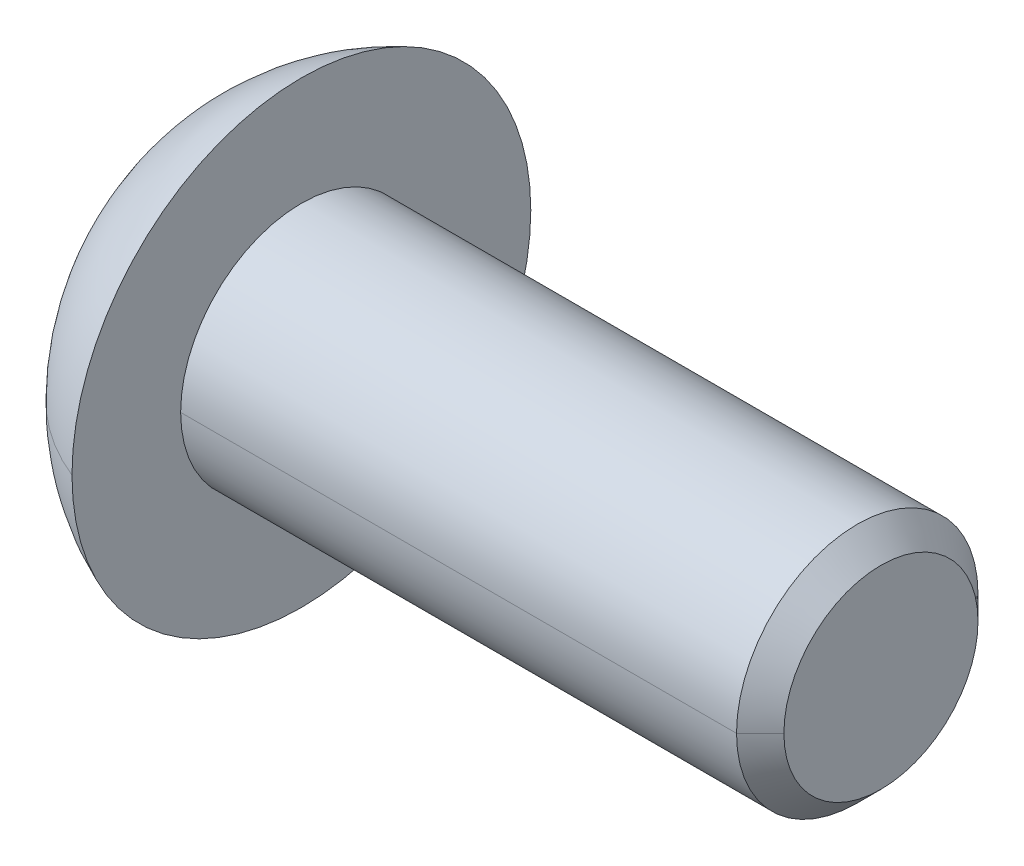
ISO-10303-21;
HEADER;
FILE_DESCRIPTION(('STEP AP214'),'2;1');
FILE_NAME('part.step','',(''),(''),'','','');
FILE_SCHEMA(('AUTOMOTIVE_DESIGN { 1 0 10303 214 1 1 1 1 }'));
ENDSEC;
DATA;
#1=APPLICATION_CONTEXT('core data for automotive mechanical design processes');
#2=APPLICATION_PROTOCOL_DEFINITION('international standard','automotive_design',2000,#1);
#3=PRODUCT_CONTEXT('',#1,'mechanical');
#4=PRODUCT('Part','Part','',(#3));
#5=PRODUCT_RELATED_PRODUCT_CATEGORY('part','',(#4));
#6=PRODUCT_DEFINITION_FORMATION('','',#4);
#7=PRODUCT_DEFINITION_CONTEXT('part definition',#1,'design');
#8=PRODUCT_DEFINITION('design','',#6,#7);
#9=PRODUCT_DEFINITION_SHAPE('','',#8);
#10=(LENGTH_UNIT() NAMED_UNIT(*) SI_UNIT(.MILLI.,.METRE.));
#11=(NAMED_UNIT(*) PLANE_ANGLE_UNIT() SI_UNIT($,.RADIAN.));
#12=(NAMED_UNIT(*) SI_UNIT($,.STERADIAN.) SOLID_ANGLE_UNIT());
#13=UNCERTAINTY_MEASURE_WITH_UNIT(LENGTH_MEASURE(1.E-05),#10,'distance_accuracy_value','');
#14=(GEOMETRIC_REPRESENTATION_CONTEXT(3) GLOBAL_UNCERTAINTY_ASSIGNED_CONTEXT((#13)) GLOBAL_UNIT_ASSIGNED_CONTEXT((#10,
#11,#12)) REPRESENTATION_CONTEXT('',''));
#15=CARTESIAN_POINT('',(0.,0.,0.));
#16=DIRECTION('',(0.,0.,1.));
#17=DIRECTION('',(1.,0.,0.));
#18=AXIS2_PLACEMENT_3D('',#15,#16,#17);
#19=CARTESIAN_POINT('',(-1.19,0.,0.));
#20=DIRECTION('',(1.,0.,0.));
#21=DIRECTION('',(0.,0.,-1.));
#22=AXIS2_PLACEMENT_3D('',#19,#20,#21);
#23=PLANE('',#22);
#24=DIRECTION('',(0.,-1.,0.));
#25=VECTOR('',#24,1.);
#26=CARTESIAN_POINT('',(-1.19,0.86602540378444,1.5));
#27=LINE('',#26,#25);
#28=CARTESIAN_POINT('',(-1.19,0.86602540378444,1.5));
#29=VERTEX_POINT('',#28);
#30=CARTESIAN_POINT('',(-1.19,0.,1.5));
#31=VERTEX_POINT('',#30);
#32=EDGE_CURVE('E10',#29,#31,#27,.T.);
#33=ORIENTED_EDGE('',*,*,#32,.F.);
#34=DIRECTION('',(0.,-0.500000000000009,0.866025403784433));
#35=VECTOR('',#34,1.);
#36=CARTESIAN_POINT('',(-1.19,1.7320508075689,0.));
#37=LINE('',#36,#35);
#38=CARTESIAN_POINT('',(-1.19,1.29903810567666,0.750000000000019));
#39=VERTEX_POINT('',#38);
#40=EDGE_CURVE('E24',#39,#29,#37,.T.);
#41=ORIENTED_EDGE('',*,*,#40,.F.);
#42=CARTESIAN_POINT('',(-1.19,0.,0.));
#43=DIRECTION('',(1.,0.,0.));
#44=DIRECTION('',(0.,0.,-1.));
#45=AXIS2_PLACEMENT_3D('',#42,#43,#44);
#46=CIRCLE('',#45,1.5);
#47=EDGE_CURVE('E391',#39,#31,#46,.T.);
#48=ORIENTED_EDGE('',*,*,#47,.T.);
#49=EDGE_LOOP('',(#33,#41,#48));
#50=FACE_BOUND('',#49,.T.);
#51=ADVANCED_FACE('F16',(#50),#23,.F.);
#52=CARTESIAN_POINT('',(-500.323974596216,0.,0.));
#53=DIRECTION('',(-1.,0.,0.));
#54=DIRECTION('',(0.,-1.,0.));
#55=AXIS2_PLACEMENT_3D('',#52,#53,#54);
#56=CONICAL_SURFACE('',#55,866.0254037844,1.0471975512);
#57=DIRECTION('',(-0.499999999997039,0.,0.866025403786148));
#58=VECTOR('',#57,1.);
#59=CARTESIAN_POINT('',(-0.323974600166881,0.,0.));
#60=LINE('',#59,#58);
#61=CARTESIAN_POINT('',(-0.32397459621556,0.,0.));
#62=VERTEX_POINT('',#61);
#63=EDGE_CURVE('E386',#62,#31,#60,.T.);
#64=ORIENTED_EDGE('',*,*,#63,.T.);
#65=ORIENTED_EDGE('',*,*,#47,.F.);
#66=CARTESIAN_POINT('',(-1.19,0.,0.));
#67=DIRECTION('',(1.,0.,0.));
#68=DIRECTION('',(0.,0.,-1.));
#69=AXIS2_PLACEMENT_3D('',#66,#67,#68);
#70=CIRCLE('',#69,1.5);
#71=CARTESIAN_POINT('',(-1.19,1.29903810567666,-0.750000000000019));
#72=VERTEX_POINT('',#71);
#73=EDGE_CURVE('E381',#72,#39,#70,.T.);
#74=ORIENTED_EDGE('',*,*,#73,.F.);
#75=CARTESIAN_POINT('',(-1.19,0.,0.));
#76=DIRECTION('',(1.,0.,0.));
#77=DIRECTION('',(0.,0.,-1.));
#78=AXIS2_PLACEMENT_3D('',#75,#76,#77);
#79=CIRCLE('',#78,1.5);
#80=CARTESIAN_POINT('',(-1.19,0.,-1.5));
#81=VERTEX_POINT('',#80);
#82=EDGE_CURVE('E376',#81,#72,#79,.T.);
#83=ORIENTED_EDGE('',*,*,#82,.F.);
#84=DIRECTION('',(-0.499999999997039,0.,-0.866025403786148));
#85=VECTOR('',#84,1.);
#86=CARTESIAN_POINT('',(-0.323974600166881,0.,0.));
#87=LINE('',#86,#85);
#88=EDGE_CURVE('E371',#62,#81,#87,.T.);
#89=ORIENTED_EDGE('',*,*,#88,.F.);
#90=EDGE_LOOP('',(#64,#65,#74,#83,#89));
#91=FACE_BOUND('',#90,.T.);
#92=ADVANCED_FACE('F407',(#91),#56,.F.);
#93=CARTESIAN_POINT('',(-500.323974596216,0.,0.));
#94=DIRECTION('',(-1.,0.,0.));
#95=DIRECTION('',(0.,1.,0.));
#96=AXIS2_PLACEMENT_3D('',#93,#94,#95);
#97=CONICAL_SURFACE('',#96,866.0254037844,1.0471975512);
#98=ORIENTED_EDGE('',*,*,#88,.T.);
#99=CARTESIAN_POINT('',(-1.19,0.,0.));
#100=DIRECTION('',(1.,0.,0.));
#101=DIRECTION('',(0.,0.,-1.));
#102=AXIS2_PLACEMENT_3D('',#99,#100,#101);
#103=CIRCLE('',#102,1.5);
#104=CARTESIAN_POINT('',(-1.19,-1.29903810567666,-0.750000000000019));
#105=VERTEX_POINT('',#104);
#106=EDGE_CURVE('E366',#105,#81,#103,.T.);
#107=ORIENTED_EDGE('',*,*,#106,.F.);
#108=CARTESIAN_POINT('',(-1.19,0.,0.));
#109=DIRECTION('',(1.,0.,0.));
#110=DIRECTION('',(0.,0.,-1.));
#111=AXIS2_PLACEMENT_3D('',#108,#109,#110);
#112=CIRCLE('',#111,1.5);
#113=CARTESIAN_POINT('',(-1.19,-1.29903810567666,0.750000000000019));
#114=VERTEX_POINT('',#113);
#115=EDGE_CURVE('E361',#114,#105,#112,.T.);
#116=ORIENTED_EDGE('',*,*,#115,.F.);
#117=CARTESIAN_POINT('',(-1.19,0.,0.));
#118=DIRECTION('',(1.,0.,0.));
#119=DIRECTION('',(0.,0.,-1.));
#120=AXIS2_PLACEMENT_3D('',#117,#118,#119);
#121=CIRCLE('',#120,1.5);
#122=EDGE_CURVE('E356',#31,#114,#121,.T.);
#123=ORIENTED_EDGE('',*,*,#122,.F.);
#124=ORIENTED_EDGE('',*,*,#63,.F.);
#125=EDGE_LOOP('',(#98,#107,#116,#123,#124));
#126=FACE_BOUND('',#125,.T.);
#127=ADVANCED_FACE('F422',(#126),#97,.F.);
#128=CARTESIAN_POINT('',(-1.19,0.,0.));
#129=DIRECTION('',(1.,0.,0.));
#130=DIRECTION('',(0.,0.,-1.));
#131=AXIS2_PLACEMENT_3D('',#128,#129,#130);
#132=PLANE('',#131);
#133=DIRECTION('',(0.,-0.500000000000009,-0.866025403784433));
#134=VECTOR('',#133,1.);
#135=CARTESIAN_POINT('',(-1.19,-0.86602540378444,1.5));
#136=LINE('',#135,#134);
#137=CARTESIAN_POINT('',(-1.19,-0.86602540378444,1.5));
#138=VERTEX_POINT('',#137);
#139=EDGE_CURVE('E351',#138,#114,#136,.T.);
#140=ORIENTED_EDGE('',*,*,#139,.F.);
#141=DIRECTION('',(0.,-1.,0.));
#142=VECTOR('',#141,1.);
#143=CARTESIAN_POINT('',(-1.19,0.86602540378444,1.5));
#144=LINE('',#143,#142);
#145=EDGE_CURVE('E346',#31,#138,#144,.T.);
#146=ORIENTED_EDGE('',*,*,#145,.F.);
#147=ORIENTED_EDGE('',*,*,#122,.T.);
#148=EDGE_LOOP('',(#140,#146,#147));
#149=FACE_BOUND('',#148,.T.);
#150=ADVANCED_FACE('F437',(#149),#132,.F.);
#151=CARTESIAN_POINT('',(-1.19,0.86602540378444,1.5));
#152=DIRECTION('',(0.,0.,-1.));
#153=DIRECTION('',(-1.,0.,0.));
#154=AXIS2_PLACEMENT_3D('',#151,#152,#153);
#155=PLANE('',#154);
#156=ORIENTED_EDGE('',*,*,#32,.T.);
#157=ORIENTED_EDGE('',*,*,#145,.T.);
#158=DIRECTION('',(-1.,0.,0.));
#159=VECTOR('',#158,1.);
#160=CARTESIAN_POINT('',(-1.19,-0.86602540378444,1.5));
#161=LINE('',#160,#159);
#162=CARTESIAN_POINT('',(-2.75,-0.86602540378444,1.5));
#163=VERTEX_POINT('',#162);
#164=EDGE_CURVE('E342',#138,#163,#161,.T.);
#165=ORIENTED_EDGE('',*,*,#164,.T.);
#166=DIRECTION('',(0.,1.,0.));
#167=VECTOR('',#166,1.);
#168=CARTESIAN_POINT('',(-2.75,1.5,1.5));
#169=LINE('',#168,#167);
#170=CARTESIAN_POINT('',(-2.75,0.86602540378444,1.5));
#171=VERTEX_POINT('',#170);
#172=EDGE_CURVE('E338',#163,#171,#169,.T.);
#173=ORIENTED_EDGE('',*,*,#172,.T.);
#174=DIRECTION('',(-1.,0.,0.));
#175=VECTOR('',#174,1.);
#176=CARTESIAN_POINT('',(-1.19,0.86602540378444,1.5));
#177=LINE('',#176,#175);
#178=EDGE_CURVE('E333',#29,#171,#177,.T.);
#179=ORIENTED_EDGE('',*,*,#178,.F.);
#180=EDGE_LOOP('',(#156,#157,#165,#173,#179));
#181=FACE_BOUND('',#180,.T.);
#182=ADVANCED_FACE('F439',(#181),#155,.T.);
#183=CARTESIAN_POINT('',(-1.19,1.7320508075689,0.));
#184=DIRECTION('',(0.,-0.866025403784433,-0.500000000000009));
#185=DIRECTION('',(0.,0.500000000000009,-0.866025403784433));
#186=AXIS2_PLACEMENT_3D('',#183,#184,#185);
#187=PLANE('',#186);
#188=DIRECTION('',(0.,-0.500000000000009,0.866025403784433));
#189=VECTOR('',#188,1.);
#190=CARTESIAN_POINT('',(-1.19,1.7320508075689,0.));
#191=LINE('',#190,#189);
#192=CARTESIAN_POINT('',(-1.19,1.7320508075689,0.));
#193=VERTEX_POINT('',#192);
#194=EDGE_CURVE('E328',#193,#39,#191,.T.);
#195=ORIENTED_EDGE('',*,*,#194,.T.);
#196=ORIENTED_EDGE('',*,*,#40,.T.);
#197=ORIENTED_EDGE('',*,*,#178,.T.);
#198=DIRECTION('',(0.,0.500000000000009,-0.866025403784433));
#199=VECTOR('',#198,1.);
#200=CARTESIAN_POINT('',(-2.75,1.67403810567667,0.100480947161682));
#201=LINE('',#200,#199);
#202=CARTESIAN_POINT('',(-2.75,1.7320508075689,0.));
#203=VERTEX_POINT('',#202);
#204=EDGE_CURVE('E324',#171,#203,#201,.T.);
#205=ORIENTED_EDGE('',*,*,#204,.T.);
#206=DIRECTION('',(-1.,0.,0.));
#207=VECTOR('',#206,1.);
#208=CARTESIAN_POINT('',(-1.19,1.7320508075689,0.));
#209=LINE('',#208,#207);
#210=EDGE_CURVE('E319',#193,#203,#209,.T.);
#211=ORIENTED_EDGE('',*,*,#210,.F.);
#212=EDGE_LOOP('',(#195,#196,#197,#205,#211));
#213=FACE_BOUND('',#212,.T.);
#214=ADVANCED_FACE('F400',(#213),#187,.T.);
#215=CARTESIAN_POINT('',(-1.19,0.86602540378444,-1.5));
#216=DIRECTION('',(0.,-0.866025403784433,0.500000000000009));
#217=DIRECTION('',(0.,-0.500000000000009,-0.866025403784433));
#218=AXIS2_PLACEMENT_3D('',#215,#216,#217);
#219=PLANE('',#218);
#220=DIRECTION('',(0.,0.500000000000009,0.866025403784433));
#221=VECTOR('',#220,1.);
#222=CARTESIAN_POINT('',(-1.19,0.86602540378444,-1.5));
#223=LINE('',#222,#221);
#224=CARTESIAN_POINT('',(-1.19,0.86602540378444,-1.5));
#225=VERTEX_POINT('',#224);
#226=EDGE_CURVE('E314',#225,#72,#223,.T.);
#227=ORIENTED_EDGE('',*,*,#226,.T.);
#228=DIRECTION('',(0.,0.500000000000009,0.866025403784433));
#229=VECTOR('',#228,1.);
#230=CARTESIAN_POINT('',(-1.19,0.86602540378444,-1.5));
#231=LINE('',#230,#229);
#232=EDGE_CURVE('E309',#72,#193,#231,.T.);
#233=ORIENTED_EDGE('',*,*,#232,.T.);
#234=ORIENTED_EDGE('',*,*,#210,.T.);
#235=DIRECTION('',(0.,-0.500000000000009,-0.866025403784433));
#236=VECTOR('',#235,1.);
#237=CARTESIAN_POINT('',(-2.75,1.67403810567667,-0.100480947161682));
#238=LINE('',#237,#236);
#239=CARTESIAN_POINT('',(-2.75,0.86602540378444,-1.5));
#240=VERTEX_POINT('',#239);
#241=EDGE_CURVE('E305',#203,#240,#238,.T.);
#242=ORIENTED_EDGE('',*,*,#241,.T.);
#243=DIRECTION('',(-1.,0.,0.));
#244=VECTOR('',#243,1.);
#245=CARTESIAN_POINT('',(-1.19,0.86602540378444,-1.5));
#246=LINE('',#245,#244);
#247=EDGE_CURVE('E300',#225,#240,#246,.T.);
#248=ORIENTED_EDGE('',*,*,#247,.F.);
#249=EDGE_LOOP('',(#227,#233,#234,#242,#248));
#250=FACE_BOUND('',#249,.T.);
#251=ADVANCED_FACE('F410',(#250),#219,.T.);
#252=CARTESIAN_POINT('',(-1.19,-0.86602540378444,-1.5));
#253=DIRECTION('',(0.,0.,1.));
#254=DIRECTION('',(1.,0.,0.));
#255=AXIS2_PLACEMENT_3D('',#252,#253,#254);
#256=PLANE('',#255);
#257=DIRECTION('',(0.,1.,0.));
#258=VECTOR('',#257,1.);
#259=CARTESIAN_POINT('',(-1.19,-0.86602540378444,-1.5));
#260=LINE('',#259,#258);
#261=CARTESIAN_POINT('',(-1.19,-0.86602540378444,-1.5));
#262=VERTEX_POINT('',#261);
#263=EDGE_CURVE('E295',#262,#81,#260,.T.);
#264=ORIENTED_EDGE('',*,*,#263,.T.);
#265=DIRECTION('',(0.,1.,0.));
#266=VECTOR('',#265,1.);
#267=CARTESIAN_POINT('',(-1.19,-0.86602540378444,-1.5));
#268=LINE('',#267,#266);
#269=EDGE_CURVE('E290',#81,#225,#268,.T.);
#270=ORIENTED_EDGE('',*,*,#269,.T.);
#271=ORIENTED_EDGE('',*,*,#247,.T.);
#272=DIRECTION('',(0.,-1.,0.));
#273=VECTOR('',#272,1.);
#274=CARTESIAN_POINT('',(-2.75,1.5,-1.5));
#275=LINE('',#274,#273);
#276=CARTESIAN_POINT('',(-2.75,-0.86602540378444,-1.5));
#277=VERTEX_POINT('',#276);
#278=EDGE_CURVE('E286',#240,#277,#275,.T.);
#279=ORIENTED_EDGE('',*,*,#278,.T.);
#280=DIRECTION('',(-1.,0.,0.));
#281=VECTOR('',#280,1.);
#282=CARTESIAN_POINT('',(-1.19,-0.86602540378444,-1.5));
#283=LINE('',#282,#281);
#284=EDGE_CURVE('E281',#262,#277,#283,.T.);
#285=ORIENTED_EDGE('',*,*,#284,.F.);
#286=EDGE_LOOP('',(#264,#270,#271,#279,#285));
#287=FACE_BOUND('',#286,.T.);
#288=ADVANCED_FACE('F415',(#287),#256,.T.);
#289=CARTESIAN_POINT('',(-1.19,-1.7320508075689,0.));
#290=DIRECTION('',(0.,0.866025403784433,0.500000000000009));
#291=DIRECTION('',(0.,-0.500000000000009,0.866025403784433));
#292=AXIS2_PLACEMENT_3D('',#289,#290,#291);
#293=PLANE('',#292);
#294=DIRECTION('',(0.,0.500000000000009,-0.866025403784433));
#295=VECTOR('',#294,1.);
#296=CARTESIAN_POINT('',(-1.19,-1.7320508075689,0.));
#297=LINE('',#296,#295);
#298=CARTESIAN_POINT('',(-1.19,-1.7320508075689,0.));
#299=VERTEX_POINT('',#298);
#300=EDGE_CURVE('E276',#299,#105,#297,.T.);
#301=ORIENTED_EDGE('',*,*,#300,.T.);
#302=DIRECTION('',(0.,0.500000000000009,-0.866025403784433));
#303=VECTOR('',#302,1.);
#304=CARTESIAN_POINT('',(-1.19,-1.7320508075689,0.));
#305=LINE('',#304,#303);
#306=EDGE_CURVE('E271',#105,#262,#305,.T.);
#307=ORIENTED_EDGE('',*,*,#306,.T.);
#308=ORIENTED_EDGE('',*,*,#284,.T.);
#309=DIRECTION('',(0.,-0.500000000000009,0.866025403784433));
#310=VECTOR('',#309,1.);
#311=CARTESIAN_POINT('',(-2.75,-0.924038105676645,-1.39951905283836));
#312=LINE('',#311,#310);
#313=CARTESIAN_POINT('',(-2.75,-1.7320508075689,0.));
#314=VERTEX_POINT('',#313);
#315=EDGE_CURVE('E267',#277,#314,#312,.T.);
#316=ORIENTED_EDGE('',*,*,#315,.T.);
#317=DIRECTION('',(-1.,0.,0.));
#318=VECTOR('',#317,1.);
#319=CARTESIAN_POINT('',(-1.19,-1.7320508075689,0.));
#320=LINE('',#319,#318);
#321=EDGE_CURVE('E262',#299,#314,#320,.T.);
#322=ORIENTED_EDGE('',*,*,#321,.F.);
#323=EDGE_LOOP('',(#301,#307,#308,#316,#322));
#324=FACE_BOUND('',#323,.T.);
#325=ADVANCED_FACE('F427',(#324),#293,.T.);
#326=CARTESIAN_POINT('',(-1.19,-0.86602540378444,1.5));
#327=DIRECTION('',(0.,0.866025403784433,-0.500000000000009));
#328=DIRECTION('',(0.,0.500000000000009,0.866025403784433));
#329=AXIS2_PLACEMENT_3D('',#326,#327,#328);
#330=PLANE('',#329);
#331=ORIENTED_EDGE('',*,*,#139,.T.);
#332=DIRECTION('',(0.,-0.500000000000009,-0.866025403784433));
#333=VECTOR('',#332,1.);
#334=CARTESIAN_POINT('',(-1.19,-0.86602540378444,1.5));
#335=LINE('',#334,#333);
#336=EDGE_CURVE('E257',#114,#299,#335,.T.);
#337=ORIENTED_EDGE('',*,*,#336,.T.);
#338=ORIENTED_EDGE('',*,*,#321,.T.);
#339=DIRECTION('',(0.,0.500000000000009,0.866025403784433));
#340=VECTOR('',#339,1.);
#341=CARTESIAN_POINT('',(-2.75,-0.924038105676645,1.39951905283836));
#342=LINE('',#341,#340);
#343=EDGE_CURVE('E252',#314,#163,#342,.T.);
#344=ORIENTED_EDGE('',*,*,#343,.T.);
#345=ORIENTED_EDGE('',*,*,#164,.F.);
#346=EDGE_LOOP('',(#331,#337,#338,#344,#345));
#347=FACE_BOUND('',#346,.T.);
#348=ADVANCED_FACE('F432',(#347),#330,.T.);
#349=CARTESIAN_POINT('',(-2.75,1.5,0.));
#350=DIRECTION('',(1.,0.,0.));
#351=DIRECTION('',(0.,0.,-1.));
#352=AXIS2_PLACEMENT_3D('',#349,#350,#351);
#353=PLANE('',#352);
#354=CARTESIAN_POINT('',(-2.75,0.,0.));
#355=DIRECTION('',(1.,0.,0.));
#356=DIRECTION('',(0.,0.,-1.));
#357=AXIS2_PLACEMENT_3D('',#354,#355,#356);
#358=CIRCLE('',#357,1.8);
#359=CARTESIAN_POINT('',(-2.75,0.,-1.8));
#360=VERTEX_POINT('',#359);
#361=CARTESIAN_POINT('',(-2.75,0.,1.8));
#362=VERTEX_POINT('',#361);
#363=EDGE_CURVE('E248',#360,#362,#358,.T.);
#364=ORIENTED_EDGE('',*,*,#363,.F.);
#365=CARTESIAN_POINT('',(-2.75,0.,0.));
#366=DIRECTION('',(1.,0.,0.));
#367=DIRECTION('',(0.,0.,-1.));
#368=AXIS2_PLACEMENT_3D('',#365,#366,#367);
#369=CIRCLE('',#368,1.8);
#370=EDGE_CURVE('E246',#362,#360,#369,.T.);
#371=ORIENTED_EDGE('',*,*,#370,.F.);
#372=EDGE_LOOP('',(#364,#371));
#373=FACE_BOUND('',#372,.T.);
#374=ORIENTED_EDGE('',*,*,#315,.F.);
#375=ORIENTED_EDGE('',*,*,#278,.F.);
#376=ORIENTED_EDGE('',*,*,#241,.F.);
#377=ORIENTED_EDGE('',*,*,#204,.F.);
#378=ORIENTED_EDGE('',*,*,#172,.F.);
#379=ORIENTED_EDGE('',*,*,#343,.F.);
#380=EDGE_LOOP('',(#374,#375,#376,#377,#378,#379));
#381=FACE_BOUND('',#380,.T.);
#382=ADVANCED_FACE('F443',(#373,#381),#353,.F.);
#383=CARTESIAN_POINT('',(0.,0.,4.75));
#384=CARTESIAN_POINT('',(0.,-9.5,4.75));
#385=CARTESIAN_POINT('',(0.,-9.5,-4.75));
#386=CARTESIAN_POINT('',(0.,0.,-4.75));
#387=CARTESIAN_POINT('',(-1.33136495449777,0.,4.21509314825926));
#388=CARTESIAN_POINT('',(-1.33136495449777,-8.43018629651852,4.21509314825926));
#389=CARTESIAN_POINT('',(-1.33136495449777,-8.43018629651852,-4.21509314825926));
#390=CARTESIAN_POINT('',(-1.33136495449777,0.,-4.21509314825926));
#391=CARTESIAN_POINT('',(-2.30972286373403,0.,3.16558193653309));
#392=CARTESIAN_POINT('',(-2.30972286373403,-6.33116387306619,3.1655819365331));
#393=CARTESIAN_POINT('',(-2.30972286373403,-6.33116387306619,-3.1655819365331));
#394=CARTESIAN_POINT('',(-2.30972286373403,0.,-3.16558193653309));
#395=CARTESIAN_POINT('',(-2.75,0.,1.8));
#396=CARTESIAN_POINT('',(-2.75,-3.59999999999999,1.8));
#397=CARTESIAN_POINT('',(-2.75,-3.59999999999999,-1.8));
#398=CARTESIAN_POINT('',(-2.75,0.,-1.8));
#399=(BOUNDED_SURFACE() B_SPLINE_SURFACE(3,3,((#383,#384,#385,#386),(#387,#388,#389,#390),(#391,
#392,#393,#394),(#395,#396,#397,#398)),.UNSPECIFIED.,.F.,.F.,
.F.) B_SPLINE_SURFACE_WITH_KNOTS((4,4),(4,4),(0.,7.41739745553081),(-35.5435450504011,
-16.5500534312026),
.UNSPECIFIED.) GEOMETRIC_REPRESENTATION_ITEM() RATIONAL_B_SPLINE_SURFACE(((1.,0.333333333333333,
0.333333333333333,1.),(0.936944095829158,0.312314698609719,0.312314698609719,0.936944095829158),
(0.936944095829158,0.312314698609719,0.312314698609719,0.936944095829158),(1.,0.333333333333333,
0.333333333333333,1.))) REPRESENTATION_ITEM('') SURFACE());
#400=CARTESIAN_POINT('',(0.,0.,-4.75));
#401=CARTESIAN_POINT('',(-1.33136495449777,0.,-4.21509314825926));
#402=CARTESIAN_POINT('',(-2.30972286373403,0.,-3.16558193653309));
#403=CARTESIAN_POINT('',(-2.75,0.,-1.8));
#404=(BOUNDED_CURVE() B_SPLINE_CURVE(3,(#400,#401,#402,#403),.UNSPECIFIED.,.F.,
.F.) B_SPLINE_CURVE_WITH_KNOTS((4,4),(0.,7.41739745553081),
.UNSPECIFIED.) CURVE() GEOMETRIC_REPRESENTATION_ITEM() RATIONAL_B_SPLINE_CURVE((1.,
0.936944095829158,0.936944095829158,1.)) REPRESENTATION_ITEM(''));
#405=CARTESIAN_POINT('',(0.,0.,-4.75));
#406=VERTEX_POINT('',#405);
#407=EDGE_CURVE('E214',#406,#360,#404,.T.);
#408=CARTESIAN_POINT('',(0.,0.,0.));
#409=DIRECTION('',(1.,0.,0.));
#410=DIRECTION('',(0.,0.,-1.));
#411=AXIS2_PLACEMENT_3D('',#408,#409,#410);
#412=CIRCLE('',#411,4.75);
#413=CARTESIAN_POINT('',(0.,0.,4.75));
#414=VERTEX_POINT('',#413);
#415=EDGE_CURVE('E232',#414,#406,#412,.T.);
#416=CARTESIAN_POINT('',(0.,0.,4.75));
#417=CARTESIAN_POINT('',(-1.33136495449777,0.,4.21509314825926));
#418=CARTESIAN_POINT('',(-2.30972286373403,0.,3.16558193653309));
#419=CARTESIAN_POINT('',(-2.75,0.,1.8));
#420=(BOUNDED_CURVE() B_SPLINE_CURVE(3,(#416,#417,#418,#419),.UNSPECIFIED.,.F.,
.F.) B_SPLINE_CURVE_WITH_KNOTS((4,4),(0.,7.41739745553081),
.UNSPECIFIED.) CURVE() GEOMETRIC_REPRESENTATION_ITEM() RATIONAL_B_SPLINE_CURVE((1.,
0.936944095829158,0.936944095829158,1.)) REPRESENTATION_ITEM(''));
#421=EDGE_CURVE('E217',#414,#362,#420,.T.);
#422=ORIENTED_EDGE('',*,*,#370,.T.);
#423=ORIENTED_EDGE('',*,*,#407,.F.);
#424=ORIENTED_EDGE('',*,*,#415,.F.);
#425=ORIENTED_EDGE('',*,*,#421,.T.);
#426=EDGE_LOOP('',(#422,#423,#424,#425));
#427=FACE_BOUND('',#426,.T.);
#428=ADVANCED_FACE('F189',(#427),#399,.T.);
#429=CARTESIAN_POINT('',(0.,0.,-4.75));
#430=CARTESIAN_POINT('',(0.,9.5,-4.75));
#431=CARTESIAN_POINT('',(0.,9.5,4.75));
#432=CARTESIAN_POINT('',(0.,0.,4.75));
#433=CARTESIAN_POINT('',(-1.33136495449777,0.,-4.21509314825926));
#434=CARTESIAN_POINT('',(-1.33136495449777,8.43018629651852,-4.21509314825926));
#435=CARTESIAN_POINT('',(-1.33136495449777,8.43018629651852,4.21509314825926));
#436=CARTESIAN_POINT('',(-1.33136495449777,0.,4.21509314825926));
#437=CARTESIAN_POINT('',(-2.30972286373403,0.,-3.16558193653309));
#438=CARTESIAN_POINT('',(-2.30972286373403,6.33116387306619,-3.1655819365331));
#439=CARTESIAN_POINT('',(-2.30972286373403,6.33116387306619,3.1655819365331));
#440=CARTESIAN_POINT('',(-2.30972286373403,0.,3.16558193653309));
#441=CARTESIAN_POINT('',(-2.75,0.,-1.8));
#442=CARTESIAN_POINT('',(-2.75,3.59999999999999,-1.8));
#443=CARTESIAN_POINT('',(-2.75,3.59999999999999,1.8));
#444=CARTESIAN_POINT('',(-2.75,0.,1.8));
#445=(BOUNDED_SURFACE() B_SPLINE_SURFACE(3,3,((#429,#430,#431,#432),(#433,#434,#435,#436),(#437,
#438,#439,#440),(#441,#442,#443,#444)),.UNSPECIFIED.,.F.,.F.,
.F.) B_SPLINE_SURFACE_WITH_KNOTS((4,4),(4,4),(0.,7.41739745553081),(-54.5370366695999,
-35.5435450504013),
.UNSPECIFIED.) GEOMETRIC_REPRESENTATION_ITEM() RATIONAL_B_SPLINE_SURFACE(((1.,0.333333333333333,
0.333333333333333,1.),(0.936944095829158,0.312314698609719,0.312314698609719,0.936944095829158),
(0.936944095829158,0.312314698609719,0.312314698609719,0.936944095829158),(1.,0.333333333333333,
0.333333333333333,1.))) REPRESENTATION_ITEM('') SURFACE());
#446=CARTESIAN_POINT('',(0.,0.,0.));
#447=DIRECTION('',(1.,0.,0.));
#448=DIRECTION('',(0.,0.,-1.));
#449=AXIS2_PLACEMENT_3D('',#446,#447,#448);
#450=CIRCLE('',#449,4.75);
#451=EDGE_CURVE('E167',#406,#414,#450,.T.);
#452=ORIENTED_EDGE('',*,*,#451,.F.);
#453=ORIENTED_EDGE('',*,*,#407,.T.);
#454=ORIENTED_EDGE('',*,*,#363,.T.);
#455=ORIENTED_EDGE('',*,*,#421,.F.);
#456=EDGE_LOOP('',(#452,#453,#454,#455));
#457=FACE_BOUND('',#456,.T.);
#458=ADVANCED_FACE('F176',(#457),#445,.T.);
#459=CARTESIAN_POINT('',(0.,4.75,0.));
#460=DIRECTION('',(-1.,0.,0.));
#461=DIRECTION('',(0.,0.,1.));
#462=AXIS2_PLACEMENT_3D('',#459,#460,#461);
#463=PLANE('',#462);
#464=CARTESIAN_POINT('',(0.,0.,0.));
#465=DIRECTION('',(1.,0.,0.));
#466=DIRECTION('',(0.,0.,-1.));
#467=AXIS2_PLACEMENT_3D('',#464,#465,#466);
#468=CIRCLE('',#467,2.5);
#469=CARTESIAN_POINT('',(0.,0.,-2.5));
#470=VERTEX_POINT('',#469);
#471=CARTESIAN_POINT('',(0.,0.,2.5));
#472=VERTEX_POINT('',#471);
#473=EDGE_CURVE('E162',#470,#472,#468,.T.);
#474=ORIENTED_EDGE('',*,*,#473,.F.);
#475=CARTESIAN_POINT('',(0.,0.,0.));
#476=DIRECTION('',(1.,0.,0.));
#477=DIRECTION('',(0.,0.,-1.));
#478=AXIS2_PLACEMENT_3D('',#475,#476,#477);
#479=CIRCLE('',#478,2.5);
#480=EDGE_CURVE('E157',#472,#470,#479,.T.);
#481=ORIENTED_EDGE('',*,*,#480,.F.);
#482=EDGE_LOOP('',(#474,#481));
#483=FACE_BOUND('',#482,.T.);
#484=ORIENTED_EDGE('',*,*,#451,.T.);
#485=ORIENTED_EDGE('',*,*,#415,.T.);
#486=EDGE_LOOP('',(#484,#485));
#487=FACE_BOUND('',#486,.T.);
#488=ADVANCED_FACE('F188',(#483,#487),#463,.F.);
#489=CARTESIAN_POINT('',(12.,0.,0.));
#490=DIRECTION('',(-1.,0.,0.));
#491=DIRECTION('',(0.,1.,0.));
#492=AXIS2_PLACEMENT_3D('',#489,#490,#491);
#493=CYLINDRICAL_SURFACE('',#492,2.5);
#494=ORIENTED_EDGE('',*,*,#480,.T.);
#495=DIRECTION('',(-1.,0.,0.));
#496=VECTOR('',#495,1.);
#497=CARTESIAN_POINT('',(11.5095,0.,-2.5));
#498=LINE('',#497,#496);
#499=CARTESIAN_POINT('',(11.5095,0.,-2.5));
#500=VERTEX_POINT('',#499);
#501=EDGE_CURVE('E152',#500,#470,#498,.T.);
#502=ORIENTED_EDGE('',*,*,#501,.F.);
#503=CARTESIAN_POINT('',(11.5095,0.,0.));
#504=DIRECTION('',(1.,0.,0.));
#505=DIRECTION('',(0.,0.,-1.));
#506=AXIS2_PLACEMENT_3D('',#503,#504,#505);
#507=CIRCLE('',#506,2.5);
#508=CARTESIAN_POINT('',(11.5095,0.,2.5));
#509=VERTEX_POINT('',#508);
#510=EDGE_CURVE('E148',#509,#500,#507,.T.);
#511=ORIENTED_EDGE('',*,*,#510,.F.);
#512=DIRECTION('',(-1.,0.,0.));
#513=VECTOR('',#512,1.);
#514=CARTESIAN_POINT('',(11.5095,0.,2.5));
#515=LINE('',#514,#513);
#516=EDGE_CURVE('E136',#509,#472,#515,.T.);
#517=ORIENTED_EDGE('',*,*,#516,.T.);
#518=EDGE_LOOP('',(#494,#502,#511,#517));
#519=FACE_BOUND('',#518,.T.);
#520=ADVANCED_FACE('F510',(#519),#493,.T.);
#521=CARTESIAN_POINT('',(12.,0.,0.));
#522=DIRECTION('',(-1.,0.,0.));
#523=DIRECTION('',(0.,-1.,0.));
#524=AXIS2_PLACEMENT_3D('',#521,#522,#523);
#525=CYLINDRICAL_SURFACE('',#524,2.5);
#526=CARTESIAN_POINT('',(11.5095,0.,0.));
#527=DIRECTION('',(1.,0.,0.));
#528=DIRECTION('',(0.,0.,-1.));
#529=AXIS2_PLACEMENT_3D('',#526,#527,#528);
#530=CIRCLE('',#529,2.5);
#531=EDGE_CURVE('E124',#500,#509,#530,.T.);
#532=ORIENTED_EDGE('',*,*,#531,.F.);
#533=ORIENTED_EDGE('',*,*,#501,.T.);
#534=ORIENTED_EDGE('',*,*,#473,.T.);
#535=ORIENTED_EDGE('',*,*,#516,.F.);
#536=EDGE_LOOP('',(#532,#533,#534,#535));
#537=FACE_BOUND('',#536,.T.);
#538=ADVANCED_FACE('F519',(#537),#525,.T.);
#539=CARTESIAN_POINT('',(11.5095,0.,0.));
#540=DIRECTION('',(-1.,0.,0.));
#541=DIRECTION('',(0.,-1.,0.));
#542=AXIS2_PLACEMENT_3D('',#539,#540,#541);
#543=CONICAL_SURFACE('',#542,2.5,0.7853981634);
#544=CARTESIAN_POINT('',(12.,0.,0.));
#545=DIRECTION('',(1.,0.,0.));
#546=DIRECTION('',(0.,0.,-1.));
#547=AXIS2_PLACEMENT_3D('',#544,#545,#546);
#548=CIRCLE('',#547,2.0095);
#549=CARTESIAN_POINT('',(12.,0.,-2.0095));
#550=VERTEX_POINT('',#549);
#551=CARTESIAN_POINT('',(11.9999999999987,0.,2.00949999999875));
#552=VERTEX_POINT('',#551);
#553=EDGE_CURVE('E121',#550,#552,#548,.T.);
#554=ORIENTED_EDGE('',*,*,#553,.F.);
#555=DIRECTION('',(-0.707106781184742,0.,-0.707106781188354));
#556=VECTOR('',#555,1.);
#557=CARTESIAN_POINT('',(11.9999999999987,0.,-2.00949999999875));
#558=LINE('',#557,#556);
#559=EDGE_CURVE('E127',#550,#500,#558,.T.);
#560=ORIENTED_EDGE('',*,*,#559,.T.);
#561=ORIENTED_EDGE('',*,*,#531,.T.);
#562=DIRECTION('',(-0.707106781184742,0.,0.707106781188354));
#563=VECTOR('',#562,1.);
#564=CARTESIAN_POINT('',(11.9999999999987,0.,2.00949999999875));
#565=LINE('',#564,#563);
#566=EDGE_CURVE('E116',#552,#509,#565,.T.);
#567=ORIENTED_EDGE('',*,*,#566,.F.);
#568=EDGE_LOOP('',(#554,#560,#561,#567));
#569=FACE_BOUND('',#568,.T.);
#570=ADVANCED_FACE('F118',(#569),#543,.T.);
#571=CARTESIAN_POINT('',(11.5095,0.,0.));
#572=DIRECTION('',(-1.,0.,0.));
#573=DIRECTION('',(0.,1.,0.));
#574=AXIS2_PLACEMENT_3D('',#571,#572,#573);
#575=CONICAL_SURFACE('',#574,2.5,0.7853981634);
#576=ORIENTED_EDGE('',*,*,#510,.T.);
#577=ORIENTED_EDGE('',*,*,#559,.F.);
#578=CARTESIAN_POINT('',(12.,0.,0.));
#579=DIRECTION('',(1.,0.,0.));
#580=DIRECTION('',(0.,0.,-1.));
#581=AXIS2_PLACEMENT_3D('',#578,#579,#580);
#582=CIRCLE('',#581,2.0095);
#583=EDGE_CURVE('E128',#552,#550,#582,.T.);
#584=ORIENTED_EDGE('',*,*,#583,.F.);
#585=ORIENTED_EDGE('',*,*,#566,.T.);
#586=EDGE_LOOP('',(#576,#577,#584,#585));
#587=FACE_BOUND('',#586,.T.);
#588=ADVANCED_FACE('F131',(#587),#575,.T.);
#589=CARTESIAN_POINT('',(12.,2.0095,0.));
#590=DIRECTION('',(-1.,0.,0.));
#591=DIRECTION('',(0.,0.,1.));
#592=AXIS2_PLACEMENT_3D('',#589,#590,#591);
#593=PLANE('',#592);
#594=ORIENTED_EDGE('',*,*,#553,.T.);
#595=ORIENTED_EDGE('',*,*,#583,.T.);
#596=EDGE_LOOP('',(#594,#595));
#597=FACE_BOUND('',#596,.T.);
#598=ADVANCED_FACE('F134',(#597),#593,.F.);
#599=CARTESIAN_POINT('',(-1.19,0.,0.));
#600=DIRECTION('',(1.,0.,0.));
#601=DIRECTION('',(0.,0.,-1.));
#602=AXIS2_PLACEMENT_3D('',#599,#600,#601);
#603=PLANE('',#602);
#604=ORIENTED_EDGE('',*,*,#300,.F.);
#605=ORIENTED_EDGE('',*,*,#336,.F.);
#606=ORIENTED_EDGE('',*,*,#115,.T.);
#607=EDGE_LOOP('',(#604,#605,#606));
#608=FACE_BOUND('',#607,.T.);
#609=ADVANCED_FACE('F430',(#608),#603,.F.);
#610=CARTESIAN_POINT('',(-1.19,0.,0.));
#611=DIRECTION('',(1.,0.,0.));
#612=DIRECTION('',(0.,0.,-1.));
#613=AXIS2_PLACEMENT_3D('',#610,#611,#612);
#614=PLANE('',#613);
#615=ORIENTED_EDGE('',*,*,#263,.F.);
#616=ORIENTED_EDGE('',*,*,#306,.F.);
#617=ORIENTED_EDGE('',*,*,#106,.T.);
#618=EDGE_LOOP('',(#615,#616,#617));
#619=FACE_BOUND('',#618,.T.);
#620=ADVANCED_FACE('F420',(#619),#614,.F.);
#621=CARTESIAN_POINT('',(-1.19,0.,0.));
#622=DIRECTION('',(1.,0.,0.));
#623=DIRECTION('',(0.,0.,-1.));
#624=AXIS2_PLACEMENT_3D('',#621,#622,#623);
#625=PLANE('',#624);
#626=ORIENTED_EDGE('',*,*,#226,.F.);
#627=ORIENTED_EDGE('',*,*,#269,.F.);
#628=ORIENTED_EDGE('',*,*,#82,.T.);
#629=EDGE_LOOP('',(#626,#627,#628));
#630=FACE_BOUND('',#629,.T.);
#631=ADVANCED_FACE('F413',(#630),#625,.F.);
#632=CARTESIAN_POINT('',(-1.19,0.,0.));
#633=DIRECTION('',(1.,0.,0.));
#634=DIRECTION('',(0.,0.,-1.));
#635=AXIS2_PLACEMENT_3D('',#632,#633,#634);
#636=PLANE('',#635);
#637=ORIENTED_EDGE('',*,*,#194,.F.);
#638=ORIENTED_EDGE('',*,*,#232,.F.);
#639=ORIENTED_EDGE('',*,*,#73,.T.);
#640=EDGE_LOOP('',(#637,#638,#639));
#641=FACE_BOUND('',#640,.T.);
#642=ADVANCED_FACE('F405',(#641),#636,.F.);
#643=CLOSED_SHELL('',(#51,#92,#127,#150,#182,#214,#251,#288,#325,#348,#382,#428,#458,#488,#520,
#538,#570,#588,#598,#609,#620,#631,#642));
#644=MANIFOLD_SOLID_BREP('B1',#643);
#645=ADVANCED_BREP_SHAPE_REPRESENTATION('',(#18,#644),#14);
#646=SHAPE_DEFINITION_REPRESENTATION(#9,#645);
ENDSEC;
END-ISO-10303-21;
